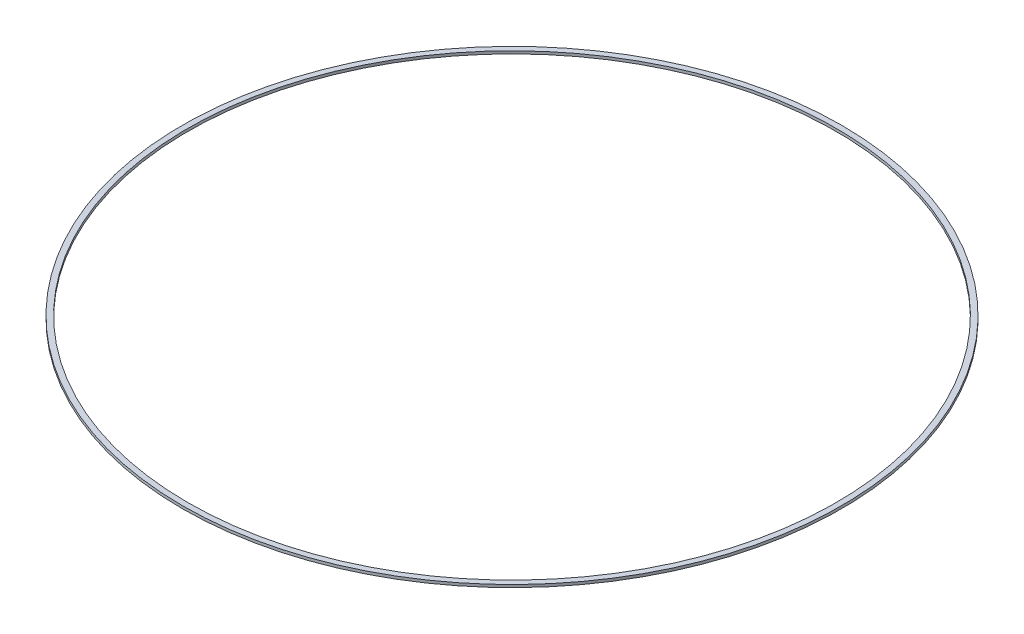
ISO-10303-21;
HEADER;
FILE_DESCRIPTION(('STEP AP214'),'2;1');
FILE_NAME('part.step','',(''),(''),'','','');
FILE_SCHEMA(('AUTOMOTIVE_DESIGN { 1 0 10303 214 1 1 1 1 }'));
ENDSEC;
DATA;
#1=APPLICATION_CONTEXT('core data for automotive mechanical design processes');
#2=APPLICATION_PROTOCOL_DEFINITION('international standard','automotive_design',2000,#1);
#3=PRODUCT_CONTEXT('',#1,'mechanical');
#4=PRODUCT('Part','Part','',(#3));
#5=PRODUCT_RELATED_PRODUCT_CATEGORY('part','',(#4));
#6=PRODUCT_DEFINITION_FORMATION('','',#4);
#7=PRODUCT_DEFINITION_CONTEXT('part definition',#1,'design');
#8=PRODUCT_DEFINITION('design','',#6,#7);
#9=PRODUCT_DEFINITION_SHAPE('','',#8);
#10=(LENGTH_UNIT() NAMED_UNIT(*) SI_UNIT(.MILLI.,.METRE.));
#11=(NAMED_UNIT(*) PLANE_ANGLE_UNIT() SI_UNIT($,.RADIAN.));
#12=(NAMED_UNIT(*) SI_UNIT($,.STERADIAN.) SOLID_ANGLE_UNIT());
#13=UNCERTAINTY_MEASURE_WITH_UNIT(LENGTH_MEASURE(1.E-05),#10,'distance_accuracy_value','');
#14=(GEOMETRIC_REPRESENTATION_CONTEXT(3) GLOBAL_UNCERTAINTY_ASSIGNED_CONTEXT((#13)) GLOBAL_UNIT_ASSIGNED_CONTEXT((#10,
#11,#12)) REPRESENTATION_CONTEXT('',''));
#15=CARTESIAN_POINT('',(0.,0.,0.));
#16=DIRECTION('',(0.,0.,1.));
#17=DIRECTION('',(1.,0.,0.));
#18=AXIS2_PLACEMENT_3D('',#15,#16,#17);
#19=CARTESIAN_POINT('',(-43.5683949065646,1.27,20.9069814484521));
#20=DIRECTION('',(0.,1.,0.));
#21=DIRECTION('',(0.,0.,1.));
#22=AXIS2_PLACEMENT_3D('',#19,#20,#21);
#23=PLANE('',#22);
#24=CARTESIAN_POINT('',(-43.5683949065646,1.27,20.9069814484521));
#25=DIRECTION('',(0.,1.,0.));
#26=DIRECTION('',(0.,0.,1.));
#27=AXIS2_PLACEMENT_3D('',#24,#25,#26);
#28=CIRCLE('',#27,154.94);
#29=CARTESIAN_POINT('',(-43.5683949065646,1.27,175.846981448452));
#30=VERTEX_POINT('',#29);
#31=EDGE_CURVE('E10',#30,#30,#28,.T.);
#32=ORIENTED_EDGE('',*,*,#31,.T.);
#33=EDGE_LOOP('',(#32));
#34=FACE_BOUND('',#33,.T.);
#35=CARTESIAN_POINT('',(-43.5683949065646,1.27,20.9069814484521));
#36=DIRECTION('',(0.,1.,0.));
#37=DIRECTION('',(0.,0.,1.));
#38=AXIS2_PLACEMENT_3D('',#35,#36,#37);
#39=CIRCLE('',#38,152.4);
#40=CARTESIAN_POINT('',(-43.5683949065646,1.27,173.306981448452));
#41=VERTEX_POINT('',#40);
#42=EDGE_CURVE('E40',#41,#41,#39,.T.);
#43=ORIENTED_EDGE('',*,*,#42,.F.);
#44=EDGE_LOOP('',(#43));
#45=FACE_BOUND('',#44,.T.);
#46=ADVANCED_FACE('F29',(#34,#45),#23,.T.);
#47=CARTESIAN_POINT('',(-43.5683949065646,0.,20.9069814484521));
#48=DIRECTION('',(0.,1.,0.));
#49=DIRECTION('',(0.,0.,1.));
#50=AXIS2_PLACEMENT_3D('',#47,#48,#49);
#51=PLANE('',#50);
#52=CARTESIAN_POINT('',(-43.5683949065646,0.,20.9069814484521));
#53=DIRECTION('',(0.,1.,0.));
#54=DIRECTION('',(0.,0.,1.));
#55=AXIS2_PLACEMENT_3D('',#52,#53,#54);
#56=CIRCLE('',#55,154.94);
#57=CARTESIAN_POINT('',(-43.5683949065646,0.,175.846981448452));
#58=VERTEX_POINT('',#57);
#59=EDGE_CURVE('E33',#58,#58,#56,.T.);
#60=ORIENTED_EDGE('',*,*,#59,.F.);
#61=EDGE_LOOP('',(#60));
#62=FACE_BOUND('',#61,.T.);
#63=CARTESIAN_POINT('',(-43.5683949065646,0.,20.9069814484521));
#64=DIRECTION('',(0.,1.,0.));
#65=DIRECTION('',(0.,0.,1.));
#66=AXIS2_PLACEMENT_3D('',#63,#64,#65);
#67=CIRCLE('',#66,152.4);
#68=CARTESIAN_POINT('',(-43.5683949065646,0.,173.306981448452));
#69=VERTEX_POINT('',#68);
#70=EDGE_CURVE('E42',#69,#69,#67,.T.);
#71=ORIENTED_EDGE('',*,*,#70,.T.);
#72=EDGE_LOOP('',(#71));
#73=FACE_BOUND('',#72,.T.);
#74=ADVANCED_FACE('F52',(#62,#73),#51,.F.);
#75=CARTESIAN_POINT('',(-43.5683949065646,1.27,20.9069814484521));
#76=DIRECTION('',(0.,-1.,0.));
#77=DIRECTION('',(0.,0.,-1.));
#78=AXIS2_PLACEMENT_3D('',#75,#76,#77);
#79=CYLINDRICAL_SURFACE('',#78,154.94);
#80=ORIENTED_EDGE('',*,*,#31,.F.);
#81=EDGE_LOOP('',(#80));
#82=FACE_BOUND('',#81,.T.);
#83=ORIENTED_EDGE('',*,*,#59,.T.);
#84=EDGE_LOOP('',(#83));
#85=FACE_BOUND('',#84,.T.);
#86=ADVANCED_FACE('F31',(#82,#85),#79,.T.);
#87=CARTESIAN_POINT('',(-43.5683949065646,1.27,20.9069814484521));
#88=DIRECTION('',(0.,-1.,0.));
#89=DIRECTION('',(0.,0.,-1.));
#90=AXIS2_PLACEMENT_3D('',#87,#88,#89);
#91=CYLINDRICAL_SURFACE('',#90,152.4);
#92=ORIENTED_EDGE('',*,*,#42,.T.);
#93=EDGE_LOOP('',(#92));
#94=FACE_BOUND('',#93,.T.);
#95=ORIENTED_EDGE('',*,*,#70,.F.);
#96=EDGE_LOOP('',(#95));
#97=FACE_BOUND('',#96,.T.);
#98=ADVANCED_FACE('F48',(#94,#97),#91,.F.);
#99=CLOSED_SHELL('',(#46,#74,#86,#98));
#100=MANIFOLD_SOLID_BREP('B2',#99);
#101=ADVANCED_BREP_SHAPE_REPRESENTATION('',(#18,#100),#14);
#102=SHAPE_DEFINITION_REPRESENTATION(#9,#101);
ENDSEC;
END-ISO-10303-21;
